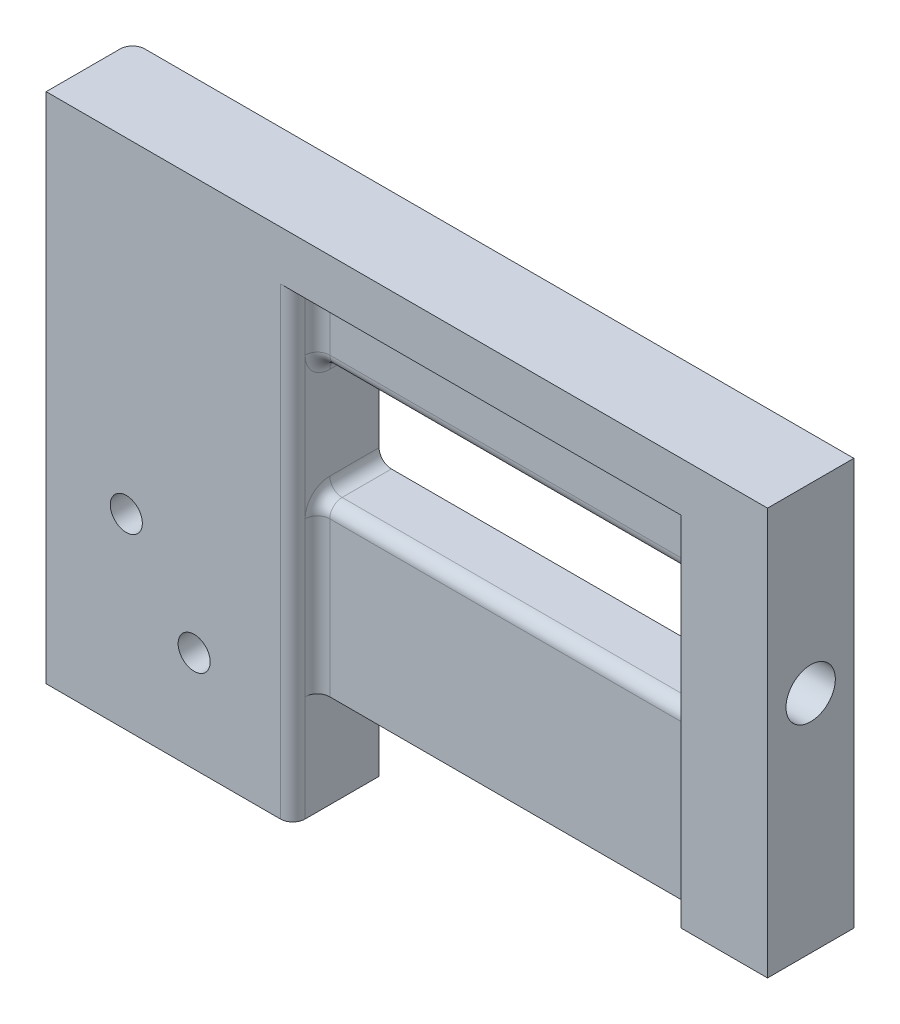
ISO-10303-21;
HEADER;
FILE_DESCRIPTION(('STEP AP214'),'2;1');
FILE_NAME('part.step','',(''),(''),'','','');
FILE_SCHEMA(('AUTOMOTIVE_DESIGN { 1 0 10303 214 1 1 1 1 }'));
ENDSEC;
DATA;
#1=APPLICATION_CONTEXT('core data for automotive mechanical design processes');
#2=APPLICATION_PROTOCOL_DEFINITION('international standard','automotive_design',2000,#1);
#3=PRODUCT_CONTEXT('',#1,'mechanical');
#4=PRODUCT('Part','Part','',(#3));
#5=PRODUCT_RELATED_PRODUCT_CATEGORY('part','',(#4));
#6=PRODUCT_DEFINITION_FORMATION('','',#4);
#7=PRODUCT_DEFINITION_CONTEXT('part definition',#1,'design');
#8=PRODUCT_DEFINITION('design','',#6,#7);
#9=PRODUCT_DEFINITION_SHAPE('','',#8);
#10=(LENGTH_UNIT() NAMED_UNIT(*) SI_UNIT(.MILLI.,.METRE.));
#11=(NAMED_UNIT(*) PLANE_ANGLE_UNIT() SI_UNIT($,.RADIAN.));
#12=(NAMED_UNIT(*) SI_UNIT($,.STERADIAN.) SOLID_ANGLE_UNIT());
#13=UNCERTAINTY_MEASURE_WITH_UNIT(LENGTH_MEASURE(1.E-05),#10,'distance_accuracy_value','');
#14=(GEOMETRIC_REPRESENTATION_CONTEXT(3) GLOBAL_UNCERTAINTY_ASSIGNED_CONTEXT((#13)) GLOBAL_UNIT_ASSIGNED_CONTEXT((#10,
#11,#12)) REPRESENTATION_CONTEXT('',''));
#15=CARTESIAN_POINT('',(0.,0.,0.));
#16=DIRECTION('',(0.,0.,1.));
#17=DIRECTION('',(1.,0.,0.));
#18=AXIS2_PLACEMENT_3D('',#15,#16,#17);
#19=CARTESIAN_POINT('',(-15.75,9.5,5.));
#20=DIRECTION('',(1.,0.,0.));
#21=DIRECTION('',(0.,0.,-1.));
#22=AXIS2_PLACEMENT_3D('',#19,#20,#21);
#23=PLANE('',#22);
#24=CARTESIAN_POINT('',(-15.75,-1.,4.));
#25=DIRECTION('',(1.,0.,0.));
#26=DIRECTION('',(0.,0.,-1.));
#27=AXIS2_PLACEMENT_3D('',#24,#25,#26);
#28=CIRCLE('',#27,2.);
#29=CARTESIAN_POINT('',(-15.75,0.999999999999999,4.));
#30=VERTEX_POINT('',#29);
#31=CARTESIAN_POINT('',(-15.75,-1.,6.));
#32=VERTEX_POINT('',#31);
#33=EDGE_CURVE('E272',#30,#32,#28,.T.);
#34=ORIENTED_EDGE('',*,*,#33,.F.);
#35=DIRECTION('',(0.,0.,-1.));
#36=VECTOR('',#35,1.);
#37=CARTESIAN_POINT('',(-15.75,0.999999999999999,0.));
#38=LINE('',#37,#36);
#39=CARTESIAN_POINT('',(-15.75,0.999999999999999,0.));
#40=VERTEX_POINT('',#39);
#41=EDGE_CURVE('E282',#30,#40,#38,.T.);
#42=ORIENTED_EDGE('',*,*,#41,.T.);
#43=DIRECTION('',(0.,-1.,0.));
#44=VECTOR('',#43,1.);
#45=CARTESIAN_POINT('',(-15.75,9.5,0.));
#46=LINE('',#45,#44);
#47=CARTESIAN_POINT('',(-15.75,8.5,0.));
#48=VERTEX_POINT('',#47);
#49=EDGE_CURVE('E239',#48,#40,#46,.T.);
#50=ORIENTED_EDGE('',*,*,#49,.F.);
#51=DIRECTION('',(0.,0.,-1.));
#52=VECTOR('',#51,1.);
#53=CARTESIAN_POINT('',(-15.75,8.5,5.));
#54=LINE('',#53,#52);
#55=CARTESIAN_POINT('',(-15.75,8.5,4.));
#56=VERTEX_POINT('',#55);
#57=EDGE_CURVE('E280',#48,#56,#54,.F.);
#58=ORIENTED_EDGE('',*,*,#57,.T.);
#59=CARTESIAN_POINT('',(-15.75,10.5,4.));
#60=DIRECTION('',(1.,0.,0.));
#61=DIRECTION('',(0.,0.,-1.));
#62=AXIS2_PLACEMENT_3D('',#59,#60,#61);
#63=CIRCLE('',#62,2.);
#64=CARTESIAN_POINT('',(-15.75,10.5,6.));
#65=VERTEX_POINT('',#64);
#66=EDGE_CURVE('E277',#65,#56,#63,.T.);
#67=ORIENTED_EDGE('',*,*,#66,.F.);
#68=DIRECTION('',(0.,1.,0.));
#69=VECTOR('',#68,1.);
#70=CARTESIAN_POINT('',(-15.75,9.5,6.));
#71=LINE('',#70,#69);
#72=EDGE_CURVE('E275',#65,#32,#71,.F.);
#73=ORIENTED_EDGE('',*,*,#72,.T.);
#74=EDGE_LOOP('',(#34,#42,#50,#58,#67,#73));
#75=FACE_BOUND('',#74,.T.);
#76=ADVANCED_FACE('F33',(#75),#23,.T.);
#77=CARTESIAN_POINT('',(0.,0.,5.));
#78=DIRECTION('',(0.,0.,-1.));
#79=DIRECTION('',(-1.,0.,0.));
#80=AXIS2_PLACEMENT_3D('',#77,#78,#79);
#81=PLANE('',#80);
#82=DIRECTION('',(0.,-1.,0.));
#83=VECTOR('',#82,1.);
#84=CARTESIAN_POINT('',(15.75,0.,5.));
#85=LINE('',#84,#83);
#86=CARTESIAN_POINT('',(15.75,-1.,5.));
#87=VERTEX_POINT('',#86);
#88=CARTESIAN_POINT('',(15.75,-13.5,5.));
#89=VERTEX_POINT('',#88);
#90=EDGE_CURVE('E202',#87,#89,#85,.T.);
#91=ORIENTED_EDGE('',*,*,#90,.F.);
#92=DIRECTION('',(1.,0.,0.));
#93=VECTOR('',#92,1.);
#94=CARTESIAN_POINT('',(-15.75,-1.,5.));
#95=LINE('',#94,#93);
#96=CARTESIAN_POINT('',(-14.75,-1.,5.));
#97=VERTEX_POINT('',#96);
#98=EDGE_CURVE('E307',#87,#97,#95,.F.);
#99=ORIENTED_EDGE('',*,*,#98,.T.);
#100=DIRECTION('',(0.,1.,0.));
#101=VECTOR('',#100,1.);
#102=CARTESIAN_POINT('',(-14.75,0.,5.));
#103=LINE('',#102,#101);
#104=CARTESIAN_POINT('',(-14.75,-13.5,5.));
#105=VERTEX_POINT('',#104);
#106=EDGE_CURVE('E305',#97,#105,#103,.F.);
#107=ORIENTED_EDGE('',*,*,#106,.T.);
#108=DIRECTION('',(1.,0.,0.));
#109=VECTOR('',#108,1.);
#110=CARTESIAN_POINT('',(-15.75,-13.5,5.));
#111=LINE('',#110,#109);
#112=EDGE_CURVE('E256',#105,#89,#111,.T.);
#113=ORIENTED_EDGE('',*,*,#112,.T.);
#114=EDGE_LOOP('',(#91,#99,#107,#113));
#115=FACE_BOUND('',#114,.T.);
#116=ADVANCED_FACE('F394',(#115),#81,.F.);
#117=DIRECTION('',(0.,1.,0.));
#118=VECTOR('',#117,1.);
#119=CARTESIAN_POINT('',(-14.75,0.,5.));
#120=LINE('',#119,#118);
#121=CARTESIAN_POINT('',(-14.75,14.5,5.));
#122=VERTEX_POINT('',#121);
#123=CARTESIAN_POINT('',(-14.75,10.5,5.));
#124=VERTEX_POINT('',#123);
#125=EDGE_CURVE('E58',#122,#124,#120,.F.);
#126=ORIENTED_EDGE('',*,*,#125,.T.);
#127=DIRECTION('',(-1.,0.,0.));
#128=VECTOR('',#127,1.);
#129=CARTESIAN_POINT('',(15.75,10.5,5.));
#130=LINE('',#129,#128);
#131=CARTESIAN_POINT('',(15.75,10.5,5.));
#132=VERTEX_POINT('',#131);
#133=EDGE_CURVE('E312',#124,#132,#130,.F.);
#134=ORIENTED_EDGE('',*,*,#133,.T.);
#135=CARTESIAN_POINT('',(15.75,14.5,5.));
#136=VERTEX_POINT('',#135);
#137=EDGE_CURVE('E234',#136,#132,#85,.T.);
#138=ORIENTED_EDGE('',*,*,#137,.F.);
#139=DIRECTION('',(1.,0.,0.));
#140=VECTOR('',#139,1.);
#141=CARTESIAN_POINT('',(-15.75,14.5,5.));
#142=LINE('',#141,#140);
#143=EDGE_CURVE('E310',#136,#122,#142,.F.);
#144=ORIENTED_EDGE('',*,*,#143,.T.);
#145=EDGE_LOOP('',(#126,#134,#138,#144));
#146=FACE_BOUND('',#145,.T.);
#147=ADVANCED_FACE('F401',(#146),#81,.F.);
#148=CARTESIAN_POINT('',(0.,0.,0.));
#149=DIRECTION('',(0.,0.,-1.));
#150=DIRECTION('',(-1.,0.,0.));
#151=AXIS2_PLACEMENT_3D('',#148,#149,#150);
#152=PLANE('',#151);
#153=CARTESIAN_POINT('',(-23.75,-13.91,0.));
#154=DIRECTION('',(0.,0.,1.));
#155=DIRECTION('',(1.,0.,0.));
#156=AXIS2_PLACEMENT_3D('',#153,#154,#155);
#157=CIRCLE('',#156,1.3);
#158=CARTESIAN_POINT('',(-22.45,-13.91,0.));
#159=VERTEX_POINT('',#158);
#160=EDGE_CURVE('E360',#159,#159,#157,.T.);
#161=ORIENTED_EDGE('',*,*,#160,.T.);
#162=EDGE_LOOP('',(#161));
#163=FACE_BOUND('',#162,.T.);
#164=CARTESIAN_POINT('',(-29.25,-6.91,0.));
#165=DIRECTION('',(0.,0.,1.));
#166=DIRECTION('',(1.,0.,0.));
#167=AXIS2_PLACEMENT_3D('',#164,#165,#166);
#168=CIRCLE('',#167,1.3);
#169=CARTESIAN_POINT('',(-27.95,-6.91,0.));
#170=VERTEX_POINT('',#169);
#171=EDGE_CURVE('E351',#170,#170,#168,.T.);
#172=ORIENTED_EDGE('',*,*,#171,.T.);
#173=EDGE_LOOP('',(#172));
#174=FACE_BOUND('',#173,.T.);
#175=DIRECTION('',(-1.,0.,0.));
#176=VECTOR('',#175,1.);
#177=CARTESIAN_POINT('',(-15.75,9.5,0.));
#178=LINE('',#177,#176);
#179=CARTESIAN_POINT('',(15.75,9.5,0.));
#180=VERTEX_POINT('',#179);
#181=CARTESIAN_POINT('',(-14.75,9.5,0.));
#182=VERTEX_POINT('',#181);
#183=EDGE_CURVE('E248',#180,#182,#178,.T.);
#184=ORIENTED_EDGE('',*,*,#183,.T.);
#185=CARTESIAN_POINT('',(-14.75,8.5,0.));
#186=DIRECTION('',(0.,0.,-1.));
#187=DIRECTION('',(-1.,0.,0.));
#188=AXIS2_PLACEMENT_3D('',#185,#186,#187);
#189=CIRCLE('',#188,1.);
#190=EDGE_CURVE('E319',#182,#48,#189,.F.);
#191=ORIENTED_EDGE('',*,*,#190,.T.);
#192=ORIENTED_EDGE('',*,*,#49,.T.);
#193=CARTESIAN_POINT('',(-14.75,0.999999999999999,0.));
#194=DIRECTION('',(0.,0.,-1.));
#195=DIRECTION('',(-1.,0.,0.));
#196=AXIS2_PLACEMENT_3D('',#193,#194,#195);
#197=CIRCLE('',#196,1.);
#198=CARTESIAN_POINT('',(-14.75,0.,0.));
#199=VERTEX_POINT('',#198);
#200=EDGE_CURVE('E317',#40,#199,#197,.F.);
#201=ORIENTED_EDGE('',*,*,#200,.T.);
#202=DIRECTION('',(1.,0.,0.));
#203=VECTOR('',#202,1.);
#204=CARTESIAN_POINT('',(-15.75,0.,0.));
#205=LINE('',#204,#203);
#206=CARTESIAN_POINT('',(15.75,0.,0.));
#207=VERTEX_POINT('',#206);
#208=EDGE_CURVE('E242',#199,#207,#205,.T.);
#209=ORIENTED_EDGE('',*,*,#208,.T.);
#210=DIRECTION('',(0.,1.,0.));
#211=VECTOR('',#210,1.);
#212=CARTESIAN_POINT('',(15.75,0.,0.));
#213=LINE('',#212,#211);
#214=EDGE_CURVE('E245',#207,#180,#213,.T.);
#215=ORIENTED_EDGE('',*,*,#214,.T.);
#216=EDGE_LOOP('',(#184,#191,#192,#201,#209,#215));
#217=FACE_BOUND('',#216,.T.);
#218=DIRECTION('',(1.,0.,0.));
#219=VECTOR('',#218,1.);
#220=CARTESIAN_POINT('',(-35.75,-22.0874930018554,0.));
#221=LINE('',#220,#219);
#222=CARTESIAN_POINT('',(-34.75,-22.0874930018554,0.));
#223=VERTEX_POINT('',#222);
#224=CARTESIAN_POINT('',(-15.75,-22.0874930018554,0.));
#225=VERTEX_POINT('',#224);
#226=EDGE_CURVE('E221',#223,#225,#221,.T.);
#227=ORIENTED_EDGE('',*,*,#226,.F.);
#228=DIRECTION('',(0.,-1.,0.));
#229=VECTOR('',#228,1.);
#230=CARTESIAN_POINT('',(-34.75,19.5,0.));
#231=LINE('',#230,#229);
#232=CARTESIAN_POINT('',(-34.75,19.5,0.));
#233=VERTEX_POINT('',#232);
#234=EDGE_CURVE('E299',#223,#233,#231,.F.);
#235=ORIENTED_EDGE('',*,*,#234,.T.);
#236=DIRECTION('',(-1.,0.,0.));
#237=VECTOR('',#236,1.);
#238=CARTESIAN_POINT('',(-15.75,19.5,0.));
#239=LINE('',#238,#237);
#240=CARTESIAN_POINT('',(22.75,19.5,0.));
#241=VERTEX_POINT('',#240);
#242=EDGE_CURVE('E263',#241,#233,#239,.T.);
#243=ORIENTED_EDGE('',*,*,#242,.F.);
#244=DIRECTION('',(0.,1.,0.));
#245=VECTOR('',#244,1.);
#246=CARTESIAN_POINT('',(22.75,-13.5,0.));
#247=LINE('',#246,#245);
#248=CARTESIAN_POINT('',(22.75,-13.5,0.));
#249=VERTEX_POINT('',#248);
#250=EDGE_CURVE('E255',#249,#241,#247,.T.);
#251=ORIENTED_EDGE('',*,*,#250,.F.);
#252=DIRECTION('',(1.,0.,0.));
#253=VECTOR('',#252,1.);
#254=CARTESIAN_POINT('',(-15.75,-13.5,0.));
#255=LINE('',#254,#253);
#256=CARTESIAN_POINT('',(-15.75,-13.5,0.));
#257=VERTEX_POINT('',#256);
#258=EDGE_CURVE('E260',#257,#249,#255,.T.);
#259=ORIENTED_EDGE('',*,*,#258,.F.);
#260=DIRECTION('',(0.,1.,0.));
#261=VECTOR('',#260,1.);
#262=CARTESIAN_POINT('',(-15.75,15.5,0.));
#263=LINE('',#262,#261);
#264=EDGE_CURVE('E191',#225,#257,#263,.T.);
#265=ORIENTED_EDGE('',*,*,#264,.F.);
#266=EDGE_LOOP('',(#227,#235,#243,#251,#259,#265));
#267=FACE_BOUND('',#266,.T.);
#268=ADVANCED_FACE('F377',(#163,#174,#217,#267),#152,.T.);
#269=CARTESIAN_POINT('',(22.75,-13.5,5.));
#270=DIRECTION('',(-1.,0.,0.));
#271=DIRECTION('',(0.,0.,1.));
#272=AXIS2_PLACEMENT_3D('',#269,#270,#271);
#273=PLANE('',#272);
#274=CARTESIAN_POINT('',(22.75,4.75,3.5));
#275=DIRECTION('',(-1.,0.,0.));
#276=DIRECTION('',(0.,0.,1.));
#277=AXIS2_PLACEMENT_3D('',#274,#275,#276);
#278=CIRCLE('',#277,2.);
#279=CARTESIAN_POINT('',(22.75,4.75,5.5));
#280=VERTEX_POINT('',#279);
#281=EDGE_CURVE('E365',#280,#280,#278,.T.);
#282=ORIENTED_EDGE('',*,*,#281,.T.);
#283=EDGE_LOOP('',(#282));
#284=FACE_BOUND('',#283,.T.);
#285=ORIENTED_EDGE('',*,*,#250,.T.);
#286=DIRECTION('',(0.,0.,-1.));
#287=VECTOR('',#286,1.);
#288=CARTESIAN_POINT('',(22.75,19.5,5.));
#289=LINE('',#288,#287);
#290=CARTESIAN_POINT('',(22.75,19.5,7.));
#291=VERTEX_POINT('',#290);
#292=EDGE_CURVE('E268',#291,#241,#289,.T.);
#293=ORIENTED_EDGE('',*,*,#292,.F.);
#294=DIRECTION('',(0.,1.,0.));
#295=VECTOR('',#294,1.);
#296=CARTESIAN_POINT('',(22.75,-13.5,7.));
#297=LINE('',#296,#295);
#298=CARTESIAN_POINT('',(22.75,-13.5,7.));
#299=VERTEX_POINT('',#298);
#300=EDGE_CURVE('E188',#299,#291,#297,.T.);
#301=ORIENTED_EDGE('',*,*,#300,.F.);
#302=DIRECTION('',(0.,0.,-1.));
#303=VECTOR('',#302,1.);
#304=CARTESIAN_POINT('',(22.75,-13.5,5.));
#305=LINE('',#304,#303);
#306=EDGE_CURVE('E259',#299,#249,#305,.T.);
#307=ORIENTED_EDGE('',*,*,#306,.T.);
#308=EDGE_LOOP('',(#285,#293,#301,#307));
#309=FACE_BOUND('',#308,.T.);
#310=ADVANCED_FACE('F473',(#284,#309),#273,.F.);
#311=CARTESIAN_POINT('',(-15.75,19.5,5.));
#312=DIRECTION('',(0.,-1.,0.));
#313=DIRECTION('',(0.,0.,-1.));
#314=AXIS2_PLACEMENT_3D('',#311,#312,#313);
#315=PLANE('',#314);
#316=ORIENTED_EDGE('',*,*,#242,.T.);
#317=CARTESIAN_POINT('',(-34.75,19.5,1.));
#318=DIRECTION('',(0.,-1.,0.));
#319=DIRECTION('',(0.,0.,-1.));
#320=AXIS2_PLACEMENT_3D('',#317,#318,#319);
#321=CIRCLE('',#320,1.);
#322=CARTESIAN_POINT('',(-35.75,19.5,1.));
#323=VERTEX_POINT('',#322);
#324=EDGE_CURVE('E198',#233,#323,#321,.F.);
#325=ORIENTED_EDGE('',*,*,#324,.T.);
#326=DIRECTION('',(0.,0.,-1.));
#327=VECTOR('',#326,1.);
#328=CARTESIAN_POINT('',(-35.75,19.5,7.));
#329=LINE('',#328,#327);
#330=CARTESIAN_POINT('',(-35.75,19.5,7.));
#331=VERTEX_POINT('',#330);
#332=EDGE_CURVE('E194',#331,#323,#329,.T.);
#333=ORIENTED_EDGE('',*,*,#332,.F.);
#334=DIRECTION('',(-1.,0.,0.));
#335=VECTOR('',#334,1.);
#336=CARTESIAN_POINT('',(-15.75,19.5,7.));
#337=LINE('',#336,#335);
#338=EDGE_CURVE('E179',#291,#331,#337,.T.);
#339=ORIENTED_EDGE('',*,*,#338,.F.);
#340=ORIENTED_EDGE('',*,*,#292,.T.);
#341=EDGE_LOOP('',(#316,#325,#333,#339,#340));
#342=FACE_BOUND('',#341,.T.);
#343=ADVANCED_FACE('F196',(#342),#315,.F.);
#344=CARTESIAN_POINT('',(-15.75,-13.5,5.));
#345=DIRECTION('',(0.,1.,0.));
#346=DIRECTION('',(0.,0.,1.));
#347=AXIS2_PLACEMENT_3D('',#344,#345,#346);
#348=PLANE('',#347);
#349=ORIENTED_EDGE('',*,*,#306,.F.);
#350=DIRECTION('',(1.,0.,0.));
#351=VECTOR('',#350,1.);
#352=CARTESIAN_POINT('',(15.75,-13.5,7.));
#353=LINE('',#352,#351);
#354=CARTESIAN_POINT('',(15.75,-13.5,7.));
#355=VERTEX_POINT('',#354);
#356=EDGE_CURVE('E217',#355,#299,#353,.T.);
#357=ORIENTED_EDGE('',*,*,#356,.F.);
#358=DIRECTION('',(0.,0.,-1.));
#359=VECTOR('',#358,1.);
#360=CARTESIAN_POINT('',(15.75,-13.5,7.));
#361=LINE('',#360,#359);
#362=EDGE_CURVE('E220',#355,#89,#361,.T.);
#363=ORIENTED_EDGE('',*,*,#362,.T.);
#364=ORIENTED_EDGE('',*,*,#112,.F.);
#365=CARTESIAN_POINT('',(-14.75,-13.5,6.));
#366=DIRECTION('',(0.,1.,0.));
#367=DIRECTION('',(0.,0.,1.));
#368=AXIS2_PLACEMENT_3D('',#365,#366,#367);
#369=CIRCLE('',#368,1.);
#370=CARTESIAN_POINT('',(-15.75,-13.5,6.));
#371=VERTEX_POINT('',#370);
#372=EDGE_CURVE('E11',#105,#371,#369,.T.);
#373=ORIENTED_EDGE('',*,*,#372,.T.);
#374=DIRECTION('',(0.,0.,1.));
#375=VECTOR('',#374,1.);
#376=CARTESIAN_POINT('',(-15.75,-13.5,5.));
#377=LINE('',#376,#375);
#378=EDGE_CURVE('E237',#257,#371,#377,.T.);
#379=ORIENTED_EDGE('',*,*,#378,.F.);
#380=ORIENTED_EDGE('',*,*,#258,.T.);
#381=EDGE_LOOP('',(#349,#357,#363,#364,#373,#379,#380));
#382=FACE_BOUND('',#381,.T.);
#383=ADVANCED_FACE('F407',(#382),#348,.F.);
#384=ORIENTED_EDGE('',*,*,#378,.T.);
#385=DIRECTION('',(0.,1.,0.));
#386=VECTOR('',#385,1.);
#387=CARTESIAN_POINT('',(-15.75,9.5,6.));
#388=LINE('',#387,#386);
#389=CARTESIAN_POINT('',(-15.75,-22.0874930018554,6.));
#390=VERTEX_POINT('',#389);
#391=EDGE_CURVE('E270',#371,#390,#388,.F.);
#392=ORIENTED_EDGE('',*,*,#391,.T.);
#393=DIRECTION('',(0.,0.,-1.));
#394=VECTOR('',#393,1.);
#395=CARTESIAN_POINT('',(-15.75,-22.0874930018554,7.));
#396=LINE('',#395,#394);
#397=EDGE_CURVE('E230',#390,#225,#396,.T.);
#398=ORIENTED_EDGE('',*,*,#397,.T.);
#399=ORIENTED_EDGE('',*,*,#264,.T.);
#400=EDGE_LOOP('',(#384,#392,#398,#399));
#401=FACE_BOUND('',#400,.T.);
#402=ADVANCED_FACE('F397',(#401),#23,.T.);
#403=CARTESIAN_POINT('',(-15.75,0.,5.));
#404=DIRECTION('',(0.,1.,0.));
#405=DIRECTION('',(-1.,0.,0.));
#406=AXIS2_PLACEMENT_3D('',#403,#404,#405);
#407=PLANE('',#406);
#408=ORIENTED_EDGE('',*,*,#208,.F.);
#409=DIRECTION('',(0.,0.,-1.));
#410=VECTOR('',#409,1.);
#411=CARTESIAN_POINT('',(-14.75,0.,5.));
#412=LINE('',#411,#410);
#413=CARTESIAN_POINT('',(-14.75,0.,4.));
#414=VERTEX_POINT('',#413);
#415=EDGE_CURVE('E287',#199,#414,#412,.F.);
#416=ORIENTED_EDGE('',*,*,#415,.T.);
#417=DIRECTION('',(1.,0.,0.));
#418=VECTOR('',#417,1.);
#419=CARTESIAN_POINT('',(15.75,0.,4.));
#420=LINE('',#419,#418);
#421=CARTESIAN_POINT('',(15.75,0.,4.));
#422=VERTEX_POINT('',#421);
#423=EDGE_CURVE('E285',#414,#422,#420,.T.);
#424=ORIENTED_EDGE('',*,*,#423,.T.);
#425=DIRECTION('',(0.,0.,-1.));
#426=VECTOR('',#425,1.);
#427=CARTESIAN_POINT('',(15.75,0.,5.));
#428=LINE('',#427,#426);
#429=EDGE_CURVE('E253',#422,#207,#428,.T.);
#430=ORIENTED_EDGE('',*,*,#429,.T.);
#431=EDGE_LOOP('',(#408,#416,#424,#430));
#432=FACE_BOUND('',#431,.T.);
#433=ADVANCED_FACE('F406',(#432),#407,.T.);
#434=CARTESIAN_POINT('',(15.75,0.,5.));
#435=DIRECTION('',(-1.,0.,0.));
#436=DIRECTION('',(0.,0.,1.));
#437=AXIS2_PLACEMENT_3D('',#434,#435,#436);
#438=PLANE('',#437);
#439=CARTESIAN_POINT('',(15.75,4.75,3.5));
#440=DIRECTION('',(-1.,0.,0.));
#441=DIRECTION('',(0.,0.,1.));
#442=AXIS2_PLACEMENT_3D('',#439,#440,#441);
#443=CIRCLE('',#442,2.);
#444=CARTESIAN_POINT('',(15.75,4.75,5.5));
#445=VERTEX_POINT('',#444);
#446=EDGE_CURVE('E223',#445,#445,#443,.T.);
#447=ORIENTED_EDGE('',*,*,#446,.F.);
#448=EDGE_LOOP('',(#447));
#449=FACE_BOUND('',#448,.T.);
#450=DIRECTION('',(0.,0.,-1.));
#451=VECTOR('',#450,1.);
#452=CARTESIAN_POINT('',(15.75,15.5,7.));
#453=LINE('',#452,#451);
#454=CARTESIAN_POINT('',(15.75,15.5,7.));
#455=VERTEX_POINT('',#454);
#456=CARTESIAN_POINT('',(15.75,15.5,6.));
#457=VERTEX_POINT('',#456);
#458=EDGE_CURVE('E228',#455,#457,#453,.T.);
#459=ORIENTED_EDGE('',*,*,#458,.T.);
#460=CARTESIAN_POINT('',(15.75,14.5,6.));
#461=DIRECTION('',(-1.,0.,0.));
#462=DIRECTION('',(0.,0.,1.));
#463=AXIS2_PLACEMENT_3D('',#460,#461,#462);
#464=CIRCLE('',#463,1.);
#465=EDGE_CURVE('E315',#457,#136,#464,.T.);
#466=ORIENTED_EDGE('',*,*,#465,.T.);
#467=ORIENTED_EDGE('',*,*,#137,.T.);
#468=CARTESIAN_POINT('',(15.75,10.5,4.));
#469=DIRECTION('',(-1.,0.,0.));
#470=DIRECTION('',(0.,0.,1.));
#471=AXIS2_PLACEMENT_3D('',#468,#469,#470);
#472=CIRCLE('',#471,1.);
#473=CARTESIAN_POINT('',(15.75,9.5,4.));
#474=VERTEX_POINT('',#473);
#475=EDGE_CURVE('E42',#132,#474,#472,.F.);
#476=ORIENTED_EDGE('',*,*,#475,.T.);
#477=DIRECTION('',(0.,0.,-1.));
#478=VECTOR('',#477,1.);
#479=CARTESIAN_POINT('',(15.75,9.5,5.));
#480=LINE('',#479,#478);
#481=EDGE_CURVE('E251',#474,#180,#480,.T.);
#482=ORIENTED_EDGE('',*,*,#481,.T.);
#483=ORIENTED_EDGE('',*,*,#214,.F.);
#484=ORIENTED_EDGE('',*,*,#429,.F.);
#485=CARTESIAN_POINT('',(15.75,-1.,4.));
#486=DIRECTION('',(-1.,0.,0.));
#487=DIRECTION('',(0.,0.,1.));
#488=AXIS2_PLACEMENT_3D('',#485,#486,#487);
#489=CIRCLE('',#488,1.);
#490=EDGE_CURVE('E323',#422,#87,#489,.F.);
#491=ORIENTED_EDGE('',*,*,#490,.T.);
#492=ORIENTED_EDGE('',*,*,#90,.T.);
#493=ORIENTED_EDGE('',*,*,#362,.F.);
#494=DIRECTION('',(0.,-1.,0.));
#495=VECTOR('',#494,1.);
#496=CARTESIAN_POINT('',(15.75,0.,7.));
#497=LINE('',#496,#495);
#498=EDGE_CURVE('E215',#455,#355,#497,.T.);
#499=ORIENTED_EDGE('',*,*,#498,.F.);
#500=EDGE_LOOP('',(#459,#466,#467,#476,#482,#483,#484,#491,#492,#493,#499));
#501=FACE_BOUND('',#500,.T.);
#502=ADVANCED_FACE('F413',(#449,#501),#438,.T.);
#503=CARTESIAN_POINT('',(-15.75,9.5,5.));
#504=DIRECTION('',(0.,-1.,0.));
#505=DIRECTION('',(0.,0.,-1.));
#506=AXIS2_PLACEMENT_3D('',#503,#504,#505);
#507=PLANE('',#506);
#508=DIRECTION('',(-1.,0.,0.));
#509=VECTOR('',#508,1.);
#510=CARTESIAN_POINT('',(-15.75,9.5,4.));
#511=LINE('',#510,#509);
#512=CARTESIAN_POINT('',(-14.75,9.5,4.));
#513=VERTEX_POINT('',#512);
#514=EDGE_CURVE('E289',#474,#513,#511,.T.);
#515=ORIENTED_EDGE('',*,*,#514,.T.);
#516=DIRECTION('',(0.,0.,-1.));
#517=VECTOR('',#516,1.);
#518=CARTESIAN_POINT('',(-14.75,9.5,0.));
#519=LINE('',#518,#517);
#520=EDGE_CURVE('E291',#513,#182,#519,.T.);
#521=ORIENTED_EDGE('',*,*,#520,.T.);
#522=ORIENTED_EDGE('',*,*,#183,.F.);
#523=ORIENTED_EDGE('',*,*,#481,.F.);
#524=EDGE_LOOP('',(#515,#521,#522,#523));
#525=FACE_BOUND('',#524,.T.);
#526=ADVANCED_FACE('F457',(#525),#507,.T.);
#527=CARTESIAN_POINT('',(-15.75,15.5,7.));
#528=DIRECTION('',(0.,1.,0.));
#529=DIRECTION('',(0.,0.,1.));
#530=AXIS2_PLACEMENT_3D('',#527,#528,#529);
#531=PLANE('',#530);
#532=DIRECTION('',(1.,0.,0.));
#533=VECTOR('',#532,1.);
#534=CARTESIAN_POINT('',(-15.75,15.5,7.));
#535=LINE('',#534,#533);
#536=CARTESIAN_POINT('',(-16.75,15.5,7.));
#537=VERTEX_POINT('',#536);
#538=EDGE_CURVE('E210',#537,#455,#535,.T.);
#539=ORIENTED_EDGE('',*,*,#538,.F.);
#540=CARTESIAN_POINT('',(-16.75,15.5,6.));
#541=DIRECTION('',(0.,1.,0.));
#542=DIRECTION('',(0.,0.,1.));
#543=AXIS2_PLACEMENT_3D('',#540,#541,#542);
#544=CIRCLE('',#543,1.);
#545=CARTESIAN_POINT('',(-15.75,15.5,6.));
#546=VERTEX_POINT('',#545);
#547=EDGE_CURVE('E321',#537,#546,#544,.T.);
#548=ORIENTED_EDGE('',*,*,#547,.T.);
#549=DIRECTION('',(1.,0.,0.));
#550=VECTOR('',#549,1.);
#551=CARTESIAN_POINT('',(15.75,15.5,6.));
#552=LINE('',#551,#550);
#553=EDGE_CURVE('E50',#546,#457,#552,.T.);
#554=ORIENTED_EDGE('',*,*,#553,.T.);
#555=ORIENTED_EDGE('',*,*,#458,.F.);
#556=EDGE_LOOP('',(#539,#548,#554,#555));
#557=FACE_BOUND('',#556,.T.);
#558=ADVANCED_FACE('F480',(#557),#531,.F.);
#559=CARTESIAN_POINT('',(-35.75,-13.5,7.));
#560=DIRECTION('',(1.,0.,0.));
#561=DIRECTION('',(0.,0.,-1.));
#562=AXIS2_PLACEMENT_3D('',#559,#560,#561);
#563=PLANE('',#562);
#564=ORIENTED_EDGE('',*,*,#332,.T.);
#565=DIRECTION('',(0.,-1.,0.));
#566=VECTOR('',#565,1.);
#567=CARTESIAN_POINT('',(-35.75,-22.0874930018554,1.));
#568=LINE('',#567,#566);
#569=CARTESIAN_POINT('',(-35.75,-22.0874930018554,1.));
#570=VERTEX_POINT('',#569);
#571=EDGE_CURVE('E293',#323,#570,#568,.T.);
#572=ORIENTED_EDGE('',*,*,#571,.T.);
#573=DIRECTION('',(0.,0.,-1.));
#574=VECTOR('',#573,1.);
#575=CARTESIAN_POINT('',(-35.75,-22.0874930018554,7.));
#576=LINE('',#575,#574);
#577=CARTESIAN_POINT('',(-35.75,-22.0874930018554,7.));
#578=VERTEX_POINT('',#577);
#579=EDGE_CURVE('E203',#578,#570,#576,.T.);
#580=ORIENTED_EDGE('',*,*,#579,.F.);
#581=DIRECTION('',(0.,-1.,0.));
#582=VECTOR('',#581,1.);
#583=CARTESIAN_POINT('',(-35.75,19.5,7.));
#584=LINE('',#583,#582);
#585=EDGE_CURVE('E184',#331,#578,#584,.T.);
#586=ORIENTED_EDGE('',*,*,#585,.F.);
#587=EDGE_LOOP('',(#564,#572,#580,#586));
#588=FACE_BOUND('',#587,.T.);
#589=ADVANCED_FACE('F205',(#588),#563,.F.);
#590=CARTESIAN_POINT('',(-35.75,-22.0874930018554,7.));
#591=DIRECTION('',(0.,1.,0.));
#592=DIRECTION('',(0.,0.,1.));
#593=AXIS2_PLACEMENT_3D('',#590,#591,#592);
#594=PLANE('',#593);
#595=ORIENTED_EDGE('',*,*,#579,.T.);
#596=CARTESIAN_POINT('',(-34.75,-22.0874930018554,1.));
#597=DIRECTION('',(0.,1.,0.));
#598=DIRECTION('',(0.,0.,1.));
#599=AXIS2_PLACEMENT_3D('',#596,#597,#598);
#600=CIRCLE('',#599,1.);
#601=EDGE_CURVE('E297',#570,#223,#600,.F.);
#602=ORIENTED_EDGE('',*,*,#601,.T.);
#603=ORIENTED_EDGE('',*,*,#226,.T.);
#604=ORIENTED_EDGE('',*,*,#397,.F.);
#605=CARTESIAN_POINT('',(-16.75,-22.0874930018554,6.));
#606=DIRECTION('',(0.,1.,0.));
#607=DIRECTION('',(0.,0.,1.));
#608=AXIS2_PLACEMENT_3D('',#605,#606,#607);
#609=CIRCLE('',#608,1.);
#610=CARTESIAN_POINT('',(-16.75,-22.0874930018554,7.));
#611=VERTEX_POINT('',#610);
#612=EDGE_CURVE('E295',#390,#611,#609,.F.);
#613=ORIENTED_EDGE('',*,*,#612,.T.);
#614=DIRECTION('',(1.,0.,0.));
#615=VECTOR('',#614,1.);
#616=CARTESIAN_POINT('',(-35.75,-22.0874930018554,7.));
#617=LINE('',#616,#615);
#618=EDGE_CURVE('E208',#578,#611,#617,.T.);
#619=ORIENTED_EDGE('',*,*,#618,.F.);
#620=EDGE_LOOP('',(#595,#602,#603,#604,#613,#619));
#621=FACE_BOUND('',#620,.T.);
#622=ADVANCED_FACE('F478',(#621),#594,.F.);
#623=CARTESIAN_POINT('',(0.,0.,7.));
#624=DIRECTION('',(0.,0.,1.));
#625=DIRECTION('',(1.,0.,0.));
#626=AXIS2_PLACEMENT_3D('',#623,#624,#625);
#627=PLANE('',#626);
#628=CARTESIAN_POINT('',(-23.75,-13.91,7.));
#629=DIRECTION('',(0.,0.,1.));
#630=DIRECTION('',(1.,0.,0.));
#631=AXIS2_PLACEMENT_3D('',#628,#629,#630);
#632=CIRCLE('',#631,1.3);
#633=CARTESIAN_POINT('',(-22.45,-13.91,7.));
#634=VERTEX_POINT('',#633);
#635=EDGE_CURVE('E367',#634,#634,#632,.T.);
#636=ORIENTED_EDGE('',*,*,#635,.F.);
#637=EDGE_LOOP('',(#636));
#638=FACE_BOUND('',#637,.T.);
#639=CARTESIAN_POINT('',(-29.25,-6.91,7.));
#640=DIRECTION('',(0.,0.,1.));
#641=DIRECTION('',(1.,0.,0.));
#642=AXIS2_PLACEMENT_3D('',#639,#640,#641);
#643=CIRCLE('',#642,1.3);
#644=CARTESIAN_POINT('',(-27.95,-6.91,7.));
#645=VERTEX_POINT('',#644);
#646=EDGE_CURVE('E355',#645,#645,#643,.T.);
#647=ORIENTED_EDGE('',*,*,#646,.F.);
#648=EDGE_LOOP('',(#647));
#649=FACE_BOUND('',#648,.T.);
#650=ORIENTED_EDGE('',*,*,#618,.T.);
#651=DIRECTION('',(0.,1.,0.));
#652=VECTOR('',#651,1.);
#653=CARTESIAN_POINT('',(-16.75,0.,7.));
#654=LINE('',#653,#652);
#655=EDGE_CURVE('E302',#611,#537,#654,.T.);
#656=ORIENTED_EDGE('',*,*,#655,.T.);
#657=ORIENTED_EDGE('',*,*,#538,.T.);
#658=ORIENTED_EDGE('',*,*,#498,.T.);
#659=ORIENTED_EDGE('',*,*,#356,.T.);
#660=ORIENTED_EDGE('',*,*,#300,.T.);
#661=ORIENTED_EDGE('',*,*,#338,.T.);
#662=ORIENTED_EDGE('',*,*,#585,.T.);
#663=EDGE_LOOP('',(#650,#656,#657,#658,#659,#660,#661,#662));
#664=FACE_BOUND('',#663,.T.);
#665=ADVANCED_FACE('F182',(#638,#649,#664),#627,.T.);
#666=CARTESIAN_POINT('',(15.75,4.75,3.5));
#667=DIRECTION('',(1.,0.,0.));
#668=DIRECTION('',(0.,0.,-1.));
#669=AXIS2_PLACEMENT_3D('',#666,#667,#668);
#670=CYLINDRICAL_SURFACE('',#669,2.);
#671=ORIENTED_EDGE('',*,*,#446,.T.);
#672=EDGE_LOOP('',(#671));
#673=FACE_BOUND('',#672,.T.);
#674=ORIENTED_EDGE('',*,*,#281,.F.);
#675=EDGE_LOOP('',(#674));
#676=FACE_BOUND('',#675,.T.);
#677=ADVANCED_FACE('F390',(#673,#676),#670,.F.);
#678=CARTESIAN_POINT('',(-29.25,-6.91,7.));
#679=DIRECTION('',(0.,0.,-1.));
#680=DIRECTION('',(-1.,0.,0.));
#681=AXIS2_PLACEMENT_3D('',#678,#679,#680);
#682=CYLINDRICAL_SURFACE('',#681,1.3);
#683=ORIENTED_EDGE('',*,*,#646,.T.);
#684=EDGE_LOOP('',(#683));
#685=FACE_BOUND('',#684,.T.);
#686=ORIENTED_EDGE('',*,*,#171,.F.);
#687=EDGE_LOOP('',(#686));
#688=FACE_BOUND('',#687,.T.);
#689=ADVANCED_FACE('F382',(#685,#688),#682,.F.);
#690=CARTESIAN_POINT('',(-23.75,-13.91,7.));
#691=DIRECTION('',(0.,0.,-1.));
#692=DIRECTION('',(-1.,0.,0.));
#693=AXIS2_PLACEMENT_3D('',#690,#691,#692);
#694=CYLINDRICAL_SURFACE('',#693,1.3);
#695=ORIENTED_EDGE('',*,*,#635,.T.);
#696=EDGE_LOOP('',(#695));
#697=FACE_BOUND('',#696,.T.);
#698=ORIENTED_EDGE('',*,*,#160,.F.);
#699=EDGE_LOOP('',(#698));
#700=FACE_BOUND('',#699,.T.);
#701=ADVANCED_FACE('F379',(#697,#700),#694,.F.);
#702=CARTESIAN_POINT('',(-15.75,10.5,4.));
#703=DIRECTION('',(1.,0.,0.));
#704=DIRECTION('',(0.,0.,-1.));
#705=AXIS2_PLACEMENT_3D('',#702,#703,#704);
#706=CYLINDRICAL_SURFACE('',#705,1.);
#707=ORIENTED_EDGE('',*,*,#475,.F.);
#708=ORIENTED_EDGE('',*,*,#133,.F.);
#709=CARTESIAN_POINT('',(-14.75,10.5,4.));
#710=DIRECTION('',(1.,0.,0.));
#711=DIRECTION('',(0.,0.,-1.));
#712=AXIS2_PLACEMENT_3D('',#709,#710,#711);
#713=CIRCLE('',#712,1.);
#714=EDGE_CURVE('E37',#513,#124,#713,.F.);
#715=ORIENTED_EDGE('',*,*,#714,.F.);
#716=ORIENTED_EDGE('',*,*,#514,.F.);
#717=EDGE_LOOP('',(#707,#708,#715,#716));
#718=FACE_BOUND('',#717,.T.);
#719=ADVANCED_FACE('F381',(#718),#706,.T.);
#720=CARTESIAN_POINT('',(-14.75,8.5,5.));
#721=DIRECTION('',(0.,0.,1.));
#722=DIRECTION('',(1.,0.,0.));
#723=AXIS2_PLACEMENT_3D('',#720,#721,#722);
#724=CYLINDRICAL_SURFACE('',#723,1.);
#725=ORIENTED_EDGE('',*,*,#190,.F.);
#726=ORIENTED_EDGE('',*,*,#520,.F.);
#727=CARTESIAN_POINT('',(-14.75,8.5,4.));
#728=DIRECTION('',(0.,0.,-1.));
#729=DIRECTION('',(-1.,0.,0.));
#730=AXIS2_PLACEMENT_3D('',#727,#728,#729);
#731=CIRCLE('',#730,1.);
#732=EDGE_CURVE('E346',#56,#513,#731,.T.);
#733=ORIENTED_EDGE('',*,*,#732,.F.);
#734=ORIENTED_EDGE('',*,*,#57,.F.);
#735=EDGE_LOOP('',(#725,#726,#733,#734));
#736=FACE_BOUND('',#735,.T.);
#737=ADVANCED_FACE('F388',(#736),#724,.F.);
#738=CARTESIAN_POINT('',(-15.75,14.5,6.));
#739=DIRECTION('',(-1.,0.,0.));
#740=DIRECTION('',(0.,0.,1.));
#741=AXIS2_PLACEMENT_3D('',#738,#739,#740);
#742=CYLINDRICAL_SURFACE('',#741,1.);
#743=ORIENTED_EDGE('',*,*,#465,.F.);
#744=ORIENTED_EDGE('',*,*,#553,.F.);
#745=CARTESIAN_POINT('',(-14.75,14.5,6.));
#746=DIRECTION('',(-0.707106781186547,-0.707106781186547,0.));
#747=DIRECTION('',(-0.707106781186547,0.707106781186547,0.));
#748=AXIS2_PLACEMENT_3D('',#745,#746,#747);
#749=ELLIPSE('',#748,1.41421356237309,1.);
#750=EDGE_CURVE('E344',#122,#546,#749,.F.);
#751=ORIENTED_EDGE('',*,*,#750,.F.);
#752=ORIENTED_EDGE('',*,*,#143,.F.);
#753=EDGE_LOOP('',(#743,#744,#751,#752));
#754=FACE_BOUND('',#753,.T.);
#755=ADVANCED_FACE('F447',(#754),#742,.F.);
#756=CARTESIAN_POINT('',(-14.75,10.5,4.));
#757=DIRECTION('',(1.,0.,0.));
#758=DIRECTION('',(0.,0.,-1.));
#759=AXIS2_PLACEMENT_3D('',#756,#757,#758);
#760=TOROIDAL_SURFACE('',#759,2.,1.);
#761=ORIENTED_EDGE('',*,*,#732,.T.);
#762=ORIENTED_EDGE('',*,*,#714,.T.);
#763=CARTESIAN_POINT('',(-14.75,10.5,6.));
#764=DIRECTION('',(0.,1.,0.));
#765=DIRECTION('',(0.,0.,1.));
#766=AXIS2_PLACEMENT_3D('',#763,#764,#765);
#767=CIRCLE('',#766,1.);
#768=EDGE_CURVE('E341',#65,#124,#767,.F.);
#769=ORIENTED_EDGE('',*,*,#768,.F.);
#770=ORIENTED_EDGE('',*,*,#66,.T.);
#771=EDGE_LOOP('',(#761,#762,#769,#770));
#772=FACE_BOUND('',#771,.T.);
#773=ADVANCED_FACE('F668',(#772),#760,.F.);
#774=CARTESIAN_POINT('',(-14.75,9.5,6.));
#775=DIRECTION('',(0.,1.,0.));
#776=DIRECTION('',(0.,0.,1.));
#777=AXIS2_PLACEMENT_3D('',#774,#775,#776);
#778=CYLINDRICAL_SURFACE('',#777,1.);
#779=ORIENTED_EDGE('',*,*,#125,.F.);
#780=ORIENTED_EDGE('',*,*,#750,.T.);
#781=DIRECTION('',(0.,1.,0.));
#782=VECTOR('',#781,1.);
#783=CARTESIAN_POINT('',(-15.75,9.5,6.));
#784=LINE('',#783,#782);
#785=EDGE_CURVE('E338',#65,#546,#784,.T.);
#786=ORIENTED_EDGE('',*,*,#785,.F.);
#787=ORIENTED_EDGE('',*,*,#768,.T.);
#788=EDGE_LOOP('',(#779,#780,#786,#787));
#789=FACE_BOUND('',#788,.T.);
#790=ADVANCED_FACE('F442',(#789),#778,.F.);
#791=CARTESIAN_POINT('',(-16.75,0.,6.));
#792=DIRECTION('',(0.,1.,0.));
#793=DIRECTION('',(0.,0.,1.));
#794=AXIS2_PLACEMENT_3D('',#791,#792,#793);
#795=CYLINDRICAL_SURFACE('',#794,1.);
#796=ORIENTED_EDGE('',*,*,#612,.F.);
#797=ORIENTED_EDGE('',*,*,#391,.F.);
#798=DIRECTION('',(0.,1.,0.));
#799=VECTOR('',#798,1.);
#800=CARTESIAN_POINT('',(-15.75,9.5,6.));
#801=LINE('',#800,#799);
#802=EDGE_CURVE('E335',#32,#371,#801,.F.);
#803=ORIENTED_EDGE('',*,*,#802,.F.);
#804=ORIENTED_EDGE('',*,*,#72,.F.);
#805=ORIENTED_EDGE('',*,*,#785,.T.);
#806=ORIENTED_EDGE('',*,*,#547,.F.);
#807=ORIENTED_EDGE('',*,*,#655,.F.);
#808=EDGE_LOOP('',(#796,#797,#803,#804,#805,#806,#807));
#809=FACE_BOUND('',#808,.T.);
#810=ADVANCED_FACE('F428',(#809),#795,.T.);
#811=CARTESIAN_POINT('',(-15.75,-1.,4.));
#812=DIRECTION('',(-1.,0.,0.));
#813=DIRECTION('',(0.,-1.,0.));
#814=AXIS2_PLACEMENT_3D('',#811,#812,#813);
#815=CYLINDRICAL_SURFACE('',#814,1.);
#816=ORIENTED_EDGE('',*,*,#490,.F.);
#817=ORIENTED_EDGE('',*,*,#423,.F.);
#818=CARTESIAN_POINT('',(-14.75,-1.,4.));
#819=DIRECTION('',(1.,0.,0.));
#820=DIRECTION('',(0.,0.,-1.));
#821=AXIS2_PLACEMENT_3D('',#818,#819,#820);
#822=CIRCLE('',#821,1.);
#823=EDGE_CURVE('E332',#97,#414,#822,.F.);
#824=ORIENTED_EDGE('',*,*,#823,.F.);
#825=ORIENTED_EDGE('',*,*,#98,.F.);
#826=EDGE_LOOP('',(#816,#817,#824,#825));
#827=FACE_BOUND('',#826,.T.);
#828=ADVANCED_FACE('F469',(#827),#815,.T.);
#829=CARTESIAN_POINT('',(-14.75,9.5,6.));
#830=DIRECTION('',(0.,1.,0.));
#831=DIRECTION('',(0.,0.,1.));
#832=AXIS2_PLACEMENT_3D('',#829,#830,#831);
#833=CYLINDRICAL_SURFACE('',#832,1.);
#834=ORIENTED_EDGE('',*,*,#372,.F.);
#835=ORIENTED_EDGE('',*,*,#106,.F.);
#836=CARTESIAN_POINT('',(-14.75,-1.,6.));
#837=DIRECTION('',(0.,-1.,0.));
#838=DIRECTION('',(0.,0.,-1.));
#839=AXIS2_PLACEMENT_3D('',#836,#837,#838);
#840=CIRCLE('',#839,1.);
#841=EDGE_CURVE('E329',#32,#97,#840,.T.);
#842=ORIENTED_EDGE('',*,*,#841,.F.);
#843=ORIENTED_EDGE('',*,*,#802,.T.);
#844=EDGE_LOOP('',(#834,#835,#842,#843));
#845=FACE_BOUND('',#844,.T.);
#846=ADVANCED_FACE('F432',(#845),#833,.F.);
#847=CARTESIAN_POINT('',(-14.75,-1.,4.));
#848=DIRECTION('',(1.,0.,0.));
#849=DIRECTION('',(0.,0.,-1.));
#850=AXIS2_PLACEMENT_3D('',#847,#848,#849);
#851=TOROIDAL_SURFACE('',#850,2.,1.);
#852=ORIENTED_EDGE('',*,*,#841,.T.);
#853=ORIENTED_EDGE('',*,*,#823,.T.);
#854=CARTESIAN_POINT('',(-14.75,1.,4.));
#855=DIRECTION('',(0.,0.,-1.));
#856=DIRECTION('',(-1.,0.,0.));
#857=AXIS2_PLACEMENT_3D('',#854,#855,#856);
#858=CIRCLE('',#857,1.);
#859=EDGE_CURVE('E326',#30,#414,#858,.F.);
#860=ORIENTED_EDGE('',*,*,#859,.F.);
#861=ORIENTED_EDGE('',*,*,#33,.T.);
#862=EDGE_LOOP('',(#852,#853,#860,#861));
#863=FACE_BOUND('',#862,.T.);
#864=ADVANCED_FACE('F436',(#863),#851,.F.);
#865=CARTESIAN_POINT('',(-14.75,0.999999999999999,5.));
#866=DIRECTION('',(0.,0.,1.));
#867=DIRECTION('',(1.,0.,0.));
#868=AXIS2_PLACEMENT_3D('',#865,#866,#867);
#869=CYLINDRICAL_SURFACE('',#868,1.);
#870=ORIENTED_EDGE('',*,*,#859,.T.);
#871=ORIENTED_EDGE('',*,*,#415,.F.);
#872=ORIENTED_EDGE('',*,*,#200,.F.);
#873=ORIENTED_EDGE('',*,*,#41,.F.);
#874=EDGE_LOOP('',(#870,#871,#872,#873));
#875=FACE_BOUND('',#874,.T.);
#876=ADVANCED_FACE('F654',(#875),#869,.F.);
#877=CARTESIAN_POINT('',(-34.75,-13.5,1.));
#878=DIRECTION('',(0.,1.,0.));
#879=DIRECTION('',(0.,0.,1.));
#880=AXIS2_PLACEMENT_3D('',#877,#878,#879);
#881=CYLINDRICAL_SURFACE('',#880,1.);
#882=ORIENTED_EDGE('',*,*,#324,.F.);
#883=ORIENTED_EDGE('',*,*,#234,.F.);
#884=ORIENTED_EDGE('',*,*,#601,.F.);
#885=ORIENTED_EDGE('',*,*,#571,.F.);
#886=EDGE_LOOP('',(#882,#883,#884,#885));
#887=FACE_BOUND('',#886,.T.);
#888=ADVANCED_FACE('F35',(#887),#881,.T.);
#889=CLOSED_SHELL('',(#76,#116,#147,#268,#310,#343,#383,#402,#433,#502,#526,#558,#589,#622,#665,
#677,#689,#701,#719,#737,#755,#773,#790,#810,#828,#846,#864,#876,#888));
#890=MANIFOLD_SOLID_BREP('B2',#889);
#891=ADVANCED_BREP_SHAPE_REPRESENTATION('',(#18,#890),#14);
#892=SHAPE_DEFINITION_REPRESENTATION(#9,#891);
ENDSEC;
END-ISO-10303-21;
